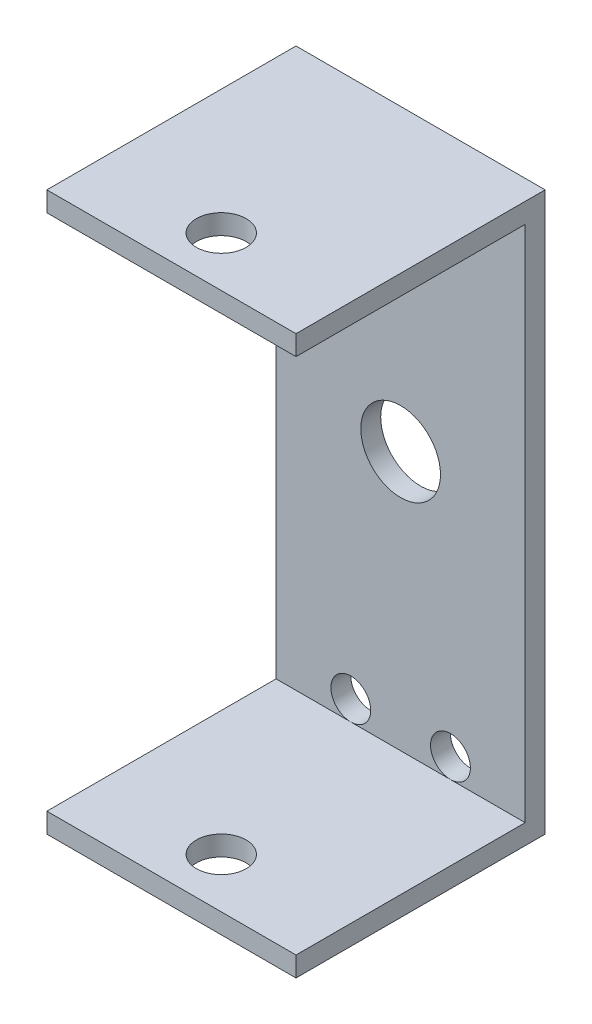
ISO-10303-21;
HEADER;
FILE_DESCRIPTION(('STEP AP214'),'2;1');
FILE_NAME('part.step','',(''),(''),'','','');
FILE_SCHEMA(('AUTOMOTIVE_DESIGN { 1 0 10303 214 1 1 1 1 }'));
ENDSEC;
DATA;
#1=APPLICATION_CONTEXT('core data for automotive mechanical design processes');
#2=APPLICATION_PROTOCOL_DEFINITION('international standard','automotive_design',2000,#1);
#3=PRODUCT_CONTEXT('',#1,'mechanical');
#4=PRODUCT('Part','Part','',(#3));
#5=PRODUCT_RELATED_PRODUCT_CATEGORY('part','',(#4));
#6=PRODUCT_DEFINITION_FORMATION('','',#4);
#7=PRODUCT_DEFINITION_CONTEXT('part definition',#1,'design');
#8=PRODUCT_DEFINITION('design','',#6,#7);
#9=PRODUCT_DEFINITION_SHAPE('','',#8);
#10=(LENGTH_UNIT() NAMED_UNIT(*) SI_UNIT(.MILLI.,.METRE.));
#11=(NAMED_UNIT(*) PLANE_ANGLE_UNIT() SI_UNIT($,.RADIAN.));
#12=(NAMED_UNIT(*) SI_UNIT($,.STERADIAN.) SOLID_ANGLE_UNIT());
#13=UNCERTAINTY_MEASURE_WITH_UNIT(LENGTH_MEASURE(1.E-05),#10,'distance_accuracy_value','');
#14=(GEOMETRIC_REPRESENTATION_CONTEXT(3) GLOBAL_UNCERTAINTY_ASSIGNED_CONTEXT((#13)) GLOBAL_UNIT_ASSIGNED_CONTEXT((#10,
#11,#12)) REPRESENTATION_CONTEXT('',''));
#15=CARTESIAN_POINT('',(0.,0.,0.));
#16=DIRECTION('',(0.,0.,1.));
#17=DIRECTION('',(1.,0.,0.));
#18=AXIS2_PLACEMENT_3D('',#15,#16,#17);
#19=CARTESIAN_POINT('',(-12.6747704507397,30.5029426241211,2.));
#20=DIRECTION('',(1.,0.,0.));
#21=DIRECTION('',(0.,1.,0.));
#22=AXIS2_PLACEMENT_3D('',#19,#20,#21);
#23=PLANE('',#22);
#24=DIRECTION('',(0.,-1.,0.));
#25=VECTOR('',#24,1.);
#26=CARTESIAN_POINT('',(-12.6747704507397,30.5029426241211,0.));
#27=LINE('',#26,#25);
#28=CARTESIAN_POINT('',(-12.6747704507397,32.5029426241211,0.));
#29=VERTEX_POINT('',#28);
#30=CARTESIAN_POINT('',(-12.6747704507397,-23.4970573758789,0.));
#31=VERTEX_POINT('',#30);
#32=EDGE_CURVE('E172',#29,#31,#27,.T.);
#33=ORIENTED_EDGE('',*,*,#32,.T.);
#34=DIRECTION('',(0.,0.,-1.));
#35=VECTOR('',#34,1.);
#36=CARTESIAN_POINT('',(-12.6747704507397,-23.4970573758789,0.));
#37=LINE('',#36,#35);
#38=CARTESIAN_POINT('',(-12.6747704507397,-23.4970573758789,25.));
#39=VERTEX_POINT('',#38);
#40=EDGE_CURVE('E119',#39,#31,#37,.T.);
#41=ORIENTED_EDGE('',*,*,#40,.F.);
#42=DIRECTION('',(0.,1.,0.));
#43=VECTOR('',#42,1.);
#44=CARTESIAN_POINT('',(-12.6747704507397,-23.4970573758789,25.));
#45=LINE('',#44,#43);
#46=CARTESIAN_POINT('',(-12.6747704507397,-21.4970573758789,25.));
#47=VERTEX_POINT('',#46);
#48=EDGE_CURVE('E115',#39,#47,#45,.T.);
#49=ORIENTED_EDGE('',*,*,#48,.T.);
#50=DIRECTION('',(0.,0.,-1.));
#51=VECTOR('',#50,1.);
#52=CARTESIAN_POINT('',(-12.6747704507397,-21.4970573758789,0.));
#53=LINE('',#52,#51);
#54=CARTESIAN_POINT('',(-12.6747704507397,-21.4970573758789,2.));
#55=VERTEX_POINT('',#54);
#56=EDGE_CURVE('E128',#47,#55,#53,.T.);
#57=ORIENTED_EDGE('',*,*,#56,.T.);
#58=DIRECTION('',(0.,-1.,0.));
#59=VECTOR('',#58,1.);
#60=CARTESIAN_POINT('',(-12.6747704507397,30.5029426241211,2.));
#61=LINE('',#60,#59);
#62=CARTESIAN_POINT('',(-12.6747704507397,30.5029426241211,2.));
#63=VERTEX_POINT('',#62);
#64=EDGE_CURVE('E157',#63,#55,#61,.T.);
#65=ORIENTED_EDGE('',*,*,#64,.F.);
#66=DIRECTION('',(0.,0.,1.));
#67=VECTOR('',#66,1.);
#68=CARTESIAN_POINT('',(-12.6747704507397,30.5029426241211,0.));
#69=LINE('',#68,#67);
#70=CARTESIAN_POINT('',(-12.6747704507397,30.5029426241211,25.));
#71=VERTEX_POINT('',#70);
#72=EDGE_CURVE('E135',#63,#71,#69,.T.);
#73=ORIENTED_EDGE('',*,*,#72,.T.);
#74=DIRECTION('',(0.,-1.,0.));
#75=VECTOR('',#74,1.);
#76=CARTESIAN_POINT('',(-12.6747704507397,32.5029426241211,25.));
#77=LINE('',#76,#75);
#78=CARTESIAN_POINT('',(-12.6747704507397,32.5029426241211,25.));
#79=VERTEX_POINT('',#78);
#80=EDGE_CURVE('E220',#79,#71,#77,.T.);
#81=ORIENTED_EDGE('',*,*,#80,.F.);
#82=DIRECTION('',(0.,0.,1.));
#83=VECTOR('',#82,1.);
#84=CARTESIAN_POINT('',(-12.6747704507397,32.5029426241211,0.));
#85=LINE('',#84,#83);
#86=EDGE_CURVE('E208',#29,#79,#85,.T.);
#87=ORIENTED_EDGE('',*,*,#86,.F.);
#88=EDGE_LOOP('',(#33,#41,#49,#57,#65,#73,#81,#87));
#89=FACE_BOUND('',#88,.T.);
#90=ADVANCED_FACE('F32',(#89),#23,.F.);
#91=CARTESIAN_POINT('',(12.3252295492603,30.5029426241211,2.));
#92=DIRECTION('',(-1.,0.,0.));
#93=DIRECTION('',(0.,-1.,0.));
#94=AXIS2_PLACEMENT_3D('',#91,#92,#93);
#95=PLANE('',#94);
#96=DIRECTION('',(0.,1.,0.));
#97=VECTOR('',#96,1.);
#98=CARTESIAN_POINT('',(12.3252295492603,30.5029426241211,0.));
#99=LINE('',#98,#97);
#100=CARTESIAN_POINT('',(12.3252295492603,-23.4970573758789,0.));
#101=VERTEX_POINT('',#100);
#102=CARTESIAN_POINT('',(12.3252295492603,32.5029426241211,0.));
#103=VERTEX_POINT('',#102);
#104=EDGE_CURVE('E168',#101,#103,#99,.T.);
#105=ORIENTED_EDGE('',*,*,#104,.T.);
#106=DIRECTION('',(0.,0.,-1.));
#107=VECTOR('',#106,1.);
#108=CARTESIAN_POINT('',(12.3252295492603,32.5029426241211,0.));
#109=LINE('',#108,#107);
#110=CARTESIAN_POINT('',(12.3252295492603,32.5029426241211,25.));
#111=VERTEX_POINT('',#110);
#112=EDGE_CURVE('E229',#111,#103,#109,.T.);
#113=ORIENTED_EDGE('',*,*,#112,.F.);
#114=DIRECTION('',(0.,-1.,0.));
#115=VECTOR('',#114,1.);
#116=CARTESIAN_POINT('',(12.3252295492603,32.5029426241211,25.));
#117=LINE('',#116,#115);
#118=CARTESIAN_POINT('',(12.3252295492603,30.5029426241211,25.));
#119=VERTEX_POINT('',#118);
#120=EDGE_CURVE('E206',#111,#119,#117,.T.);
#121=ORIENTED_EDGE('',*,*,#120,.T.);
#122=DIRECTION('',(0.,0.,-1.));
#123=VECTOR('',#122,1.);
#124=CARTESIAN_POINT('',(12.3252295492603,30.5029426241211,0.));
#125=LINE('',#124,#123);
#126=CARTESIAN_POINT('',(12.3252295492603,30.5029426241211,2.));
#127=VERTEX_POINT('',#126);
#128=EDGE_CURVE('E188',#119,#127,#125,.T.);
#129=ORIENTED_EDGE('',*,*,#128,.T.);
#130=DIRECTION('',(0.,1.,0.));
#131=VECTOR('',#130,1.);
#132=CARTESIAN_POINT('',(12.3252295492603,30.5029426241211,2.));
#133=LINE('',#132,#131);
#134=CARTESIAN_POINT('',(12.3252295492603,-21.4970573758789,2.));
#135=VERTEX_POINT('',#134);
#136=EDGE_CURVE('E177',#135,#127,#133,.T.);
#137=ORIENTED_EDGE('',*,*,#136,.F.);
#138=DIRECTION('',(0.,0.,1.));
#139=VECTOR('',#138,1.);
#140=CARTESIAN_POINT('',(12.3252295492603,-21.4970573758789,0.));
#141=LINE('',#140,#139);
#142=CARTESIAN_POINT('',(12.3252295492603,-21.4970573758789,25.));
#143=VERTEX_POINT('',#142);
#144=EDGE_CURVE('E133',#135,#143,#141,.T.);
#145=ORIENTED_EDGE('',*,*,#144,.T.);
#146=DIRECTION('',(0.,1.,0.));
#147=VECTOR('',#146,1.);
#148=CARTESIAN_POINT('',(12.3252295492603,-23.4970573758789,25.));
#149=LINE('',#148,#147);
#150=CARTESIAN_POINT('',(12.3252295492603,-23.4970573758789,25.));
#151=VERTEX_POINT('',#150);
#152=EDGE_CURVE('E113',#151,#143,#149,.T.);
#153=ORIENTED_EDGE('',*,*,#152,.F.);
#154=DIRECTION('',(0.,0.,1.));
#155=VECTOR('',#154,1.);
#156=CARTESIAN_POINT('',(12.3252295492603,-23.4970573758789,0.));
#157=LINE('',#156,#155);
#158=EDGE_CURVE('E120',#101,#151,#157,.T.);
#159=ORIENTED_EDGE('',*,*,#158,.F.);
#160=EDGE_LOOP('',(#105,#113,#121,#129,#137,#145,#153,#159));
#161=FACE_BOUND('',#160,.T.);
#162=ADVANCED_FACE('F130',(#161),#95,.F.);
#163=CARTESIAN_POINT('',(0.,0.,2.));
#164=DIRECTION('',(0.,0.,1.));
#165=DIRECTION('',(1.,0.,0.));
#166=AXIS2_PLACEMENT_3D('',#163,#164,#165);
#167=PLANE('',#166);
#168=CARTESIAN_POINT('',(-0.174770450739726,4.5029426241211,2.));
#169=DIRECTION('',(0.,0.,1.));
#170=DIRECTION('',(1.,0.,0.));
#171=AXIS2_PLACEMENT_3D('',#168,#169,#170);
#172=CIRCLE('',#171,4.);
#173=CARTESIAN_POINT('',(3.82522954926027,4.5029426241211,2.));
#174=VERTEX_POINT('',#173);
#175=EDGE_CURVE('E145',#174,#174,#172,.T.);
#176=ORIENTED_EDGE('',*,*,#175,.F.);
#177=EDGE_LOOP('',(#176));
#178=FACE_BOUND('',#177,.T.);
#179=DIRECTION('',(-1.,0.,0.));
#180=VECTOR('',#179,1.);
#181=CARTESIAN_POINT('',(-12.6747704507397,30.5029426241211,2.));
#182=LINE('',#181,#180);
#183=CARTESIAN_POINT('',(4.82522954926028,30.5029426241211,2.));
#184=VERTEX_POINT('',#183);
#185=CARTESIAN_POINT('',(-5.17477045073973,30.5029426241211,2.));
#186=VERTEX_POINT('',#185);
#187=EDGE_CURVE('E41',#184,#186,#182,.T.);
#188=ORIENTED_EDGE('',*,*,#187,.T.);
#189=CARTESIAN_POINT('',(-5.17477045073973,28.5029426241211,2.));
#190=DIRECTION('',(0.,0.,1.));
#191=DIRECTION('',(1.,0.,0.));
#192=AXIS2_PLACEMENT_3D('',#189,#190,#191);
#193=CIRCLE('',#192,2.);
#194=EDGE_CURVE('E47',#186,#186,#193,.T.);
#195=ORIENTED_EDGE('',*,*,#194,.F.);
#196=EDGE_CURVE('E35',#186,#63,#182,.T.);
#197=ORIENTED_EDGE('',*,*,#196,.T.);
#198=ORIENTED_EDGE('',*,*,#64,.T.);
#199=DIRECTION('',(1.,0.,0.));
#200=VECTOR('',#199,1.);
#201=CARTESIAN_POINT('',(-12.6747704507397,-21.4970573758789,2.));
#202=LINE('',#201,#200);
#203=CARTESIAN_POINT('',(-5.17477045073972,-21.4970573758789,2.));
#204=VERTEX_POINT('',#203);
#205=EDGE_CURVE('E164',#55,#204,#202,.T.);
#206=ORIENTED_EDGE('',*,*,#205,.T.);
#207=CARTESIAN_POINT('',(-5.17477045073972,-19.4970573758789,2.));
#208=DIRECTION('',(0.,0.,1.));
#209=DIRECTION('',(1.,0.,0.));
#210=AXIS2_PLACEMENT_3D('',#207,#208,#209);
#211=CIRCLE('',#210,2.);
#212=EDGE_CURVE('E274',#204,#204,#211,.T.);
#213=ORIENTED_EDGE('',*,*,#212,.F.);
#214=CARTESIAN_POINT('',(4.82522954926028,-21.4970573758789,2.));
#215=VERTEX_POINT('',#214);
#216=EDGE_CURVE('E170',#204,#215,#202,.T.);
#217=ORIENTED_EDGE('',*,*,#216,.T.);
#218=CARTESIAN_POINT('',(4.82522954926028,-19.4970573758789,2.));
#219=DIRECTION('',(0.,0.,1.));
#220=DIRECTION('',(1.,0.,0.));
#221=AXIS2_PLACEMENT_3D('',#218,#219,#220);
#222=CIRCLE('',#221,2.);
#223=EDGE_CURVE('E279',#215,#215,#222,.T.);
#224=ORIENTED_EDGE('',*,*,#223,.F.);
#225=EDGE_CURVE('E167',#215,#135,#202,.T.);
#226=ORIENTED_EDGE('',*,*,#225,.T.);
#227=ORIENTED_EDGE('',*,*,#136,.T.);
#228=EDGE_CURVE('E11',#127,#184,#182,.T.);
#229=ORIENTED_EDGE('',*,*,#228,.T.);
#230=CARTESIAN_POINT('',(4.82522954926028,28.5029426241211,2.));
#231=DIRECTION('',(0.,0.,1.));
#232=DIRECTION('',(1.,0.,0.));
#233=AXIS2_PLACEMENT_3D('',#230,#231,#232);
#234=CIRCLE('',#233,2.);
#235=EDGE_CURVE('E52',#184,#184,#234,.T.);
#236=ORIENTED_EDGE('',*,*,#235,.F.);
#237=EDGE_LOOP('',(#188,#195,#197,#198,#206,#213,#217,#224,#226,#227,#229,#236));
#238=FACE_BOUND('',#237,.T.);
#239=ADVANCED_FACE('F162',(#178,#238),#167,.T.);
#240=CARTESIAN_POINT('',(0.,0.,0.));
#241=DIRECTION('',(0.,0.,1.));
#242=DIRECTION('',(1.,0.,0.));
#243=AXIS2_PLACEMENT_3D('',#240,#241,#242);
#244=PLANE('',#243);
#245=CARTESIAN_POINT('',(-5.17477045073973,28.5029426241211,0.));
#246=DIRECTION('',(0.,0.,-1.));
#247=DIRECTION('',(-1.,0.,0.));
#248=AXIS2_PLACEMENT_3D('',#245,#246,#247);
#249=CIRCLE('',#248,2.);
#250=CARTESIAN_POINT('',(-7.17477045073973,28.5029426241211,0.));
#251=VERTEX_POINT('',#250);
#252=EDGE_CURVE('E289',#251,#251,#249,.T.);
#253=ORIENTED_EDGE('',*,*,#252,.F.);
#254=EDGE_LOOP('',(#253));
#255=FACE_BOUND('',#254,.T.);
#256=CARTESIAN_POINT('',(4.82522954926028,28.5029426241211,0.));
#257=DIRECTION('',(0.,0.,-1.));
#258=DIRECTION('',(-1.,0.,0.));
#259=AXIS2_PLACEMENT_3D('',#256,#257,#258);
#260=CIRCLE('',#259,2.);
#261=CARTESIAN_POINT('',(2.82522954926028,28.5029426241211,0.));
#262=VERTEX_POINT('',#261);
#263=EDGE_CURVE('E285',#262,#262,#260,.T.);
#264=ORIENTED_EDGE('',*,*,#263,.F.);
#265=EDGE_LOOP('',(#264));
#266=FACE_BOUND('',#265,.T.);
#267=CARTESIAN_POINT('',(4.82522954926028,-19.4970573758789,0.));
#268=DIRECTION('',(0.,0.,-1.));
#269=DIRECTION('',(-1.,0.,0.));
#270=AXIS2_PLACEMENT_3D('',#267,#268,#269);
#271=CIRCLE('',#270,2.);
#272=CARTESIAN_POINT('',(2.82522954926028,-19.4970573758789,0.));
#273=VERTEX_POINT('',#272);
#274=EDGE_CURVE('E281',#273,#273,#271,.T.);
#275=ORIENTED_EDGE('',*,*,#274,.F.);
#276=EDGE_LOOP('',(#275));
#277=FACE_BOUND('',#276,.T.);
#278=CARTESIAN_POINT('',(-5.17477045073972,-19.4970573758789,0.));
#279=DIRECTION('',(0.,0.,-1.));
#280=DIRECTION('',(-1.,0.,0.));
#281=AXIS2_PLACEMENT_3D('',#278,#279,#280);
#282=CIRCLE('',#281,2.);
#283=CARTESIAN_POINT('',(-7.17477045073972,-19.4970573758789,0.));
#284=VERTEX_POINT('',#283);
#285=EDGE_CURVE('E276',#284,#284,#282,.T.);
#286=ORIENTED_EDGE('',*,*,#285,.F.);
#287=EDGE_LOOP('',(#286));
#288=FACE_BOUND('',#287,.T.);
#289=CARTESIAN_POINT('',(-0.174770450739726,4.5029426241211,0.));
#290=DIRECTION('',(0.,0.,-1.));
#291=DIRECTION('',(-1.,0.,0.));
#292=AXIS2_PLACEMENT_3D('',#289,#290,#291);
#293=CIRCLE('',#292,4.);
#294=CARTESIAN_POINT('',(-4.17477045073973,4.5029426241211,0.));
#295=VERTEX_POINT('',#294);
#296=EDGE_CURVE('E260',#295,#295,#293,.T.);
#297=ORIENTED_EDGE('',*,*,#296,.F.);
#298=EDGE_LOOP('',(#297));
#299=FACE_BOUND('',#298,.T.);
#300=ORIENTED_EDGE('',*,*,#32,.F.);
#301=DIRECTION('',(-1.,0.,0.));
#302=VECTOR('',#301,1.);
#303=CARTESIAN_POINT('',(-12.6747704507397,32.5029426241211,0.));
#304=LINE('',#303,#302);
#305=EDGE_CURVE('E221',#103,#29,#304,.T.);
#306=ORIENTED_EDGE('',*,*,#305,.F.);
#307=ORIENTED_EDGE('',*,*,#104,.F.);
#308=DIRECTION('',(1.,0.,0.));
#309=VECTOR('',#308,1.);
#310=CARTESIAN_POINT('',(12.3252295492603,-23.4970573758789,0.));
#311=LINE('',#310,#309);
#312=EDGE_CURVE('E126',#31,#101,#311,.T.);
#313=ORIENTED_EDGE('',*,*,#312,.F.);
#314=EDGE_LOOP('',(#300,#306,#307,#313));
#315=FACE_BOUND('',#314,.T.);
#316=ADVANCED_FACE('F227',(#255,#266,#277,#288,#299,#315),#244,.F.);
#317=CARTESIAN_POINT('',(-12.6747704507397,32.5029426241211,25.));
#318=DIRECTION('',(0.,0.,-1.));
#319=DIRECTION('',(-1.,0.,0.));
#320=AXIS2_PLACEMENT_3D('',#317,#318,#319);
#321=PLANE('',#320);
#322=DIRECTION('',(1.,0.,0.));
#323=VECTOR('',#322,1.);
#324=CARTESIAN_POINT('',(-12.6747704507397,30.5029426241211,25.));
#325=LINE('',#324,#323);
#326=EDGE_CURVE('E137',#71,#119,#325,.T.);
#327=ORIENTED_EDGE('',*,*,#326,.T.);
#328=ORIENTED_EDGE('',*,*,#120,.F.);
#329=DIRECTION('',(1.,0.,0.));
#330=VECTOR('',#329,1.);
#331=CARTESIAN_POINT('',(-12.6747704507397,32.5029426241211,25.));
#332=LINE('',#331,#330);
#333=EDGE_CURVE('E210',#79,#111,#332,.T.);
#334=ORIENTED_EDGE('',*,*,#333,.F.);
#335=ORIENTED_EDGE('',*,*,#80,.T.);
#336=EDGE_LOOP('',(#327,#328,#334,#335));
#337=FACE_BOUND('',#336,.T.);
#338=ADVANCED_FACE('F234',(#337),#321,.F.);
#339=CARTESIAN_POINT('',(0.,32.5029426241211,0.));
#340=DIRECTION('',(0.,1.,0.));
#341=DIRECTION('',(0.,0.,1.));
#342=AXIS2_PLACEMENT_3D('',#339,#340,#341);
#343=PLANE('',#342);
#344=CARTESIAN_POINT('',(-0.174770450739719,32.5029426241211,20.));
#345=DIRECTION('',(0.,1.,0.));
#346=DIRECTION('',(0.,0.,1.));
#347=AXIS2_PLACEMENT_3D('',#344,#345,#346);
#348=CIRCLE('',#347,2.5);
#349=CARTESIAN_POINT('',(-0.174770450739719,32.5029426241211,17.5));
#350=VERTEX_POINT('',#349);
#351=EDGE_CURVE('E263',#350,#350,#348,.T.);
#352=ORIENTED_EDGE('',*,*,#351,.F.);
#353=EDGE_LOOP('',(#352));
#354=FACE_BOUND('',#353,.T.);
#355=ORIENTED_EDGE('',*,*,#86,.T.);
#356=ORIENTED_EDGE('',*,*,#333,.T.);
#357=ORIENTED_EDGE('',*,*,#112,.T.);
#358=ORIENTED_EDGE('',*,*,#305,.T.);
#359=EDGE_LOOP('',(#355,#356,#357,#358));
#360=FACE_BOUND('',#359,.T.);
#361=ADVANCED_FACE('F231',(#354,#360),#343,.T.);
#362=CARTESIAN_POINT('',(0.,30.5029426241211,0.));
#363=DIRECTION('',(0.,1.,0.));
#364=DIRECTION('',(0.,0.,1.));
#365=AXIS2_PLACEMENT_3D('',#362,#363,#364);
#366=PLANE('',#365);
#367=ORIENTED_EDGE('',*,*,#196,.F.);
#368=ORIENTED_EDGE('',*,*,#187,.F.);
#369=ORIENTED_EDGE('',*,*,#228,.F.);
#370=ORIENTED_EDGE('',*,*,#128,.F.);
#371=ORIENTED_EDGE('',*,*,#326,.F.);
#372=ORIENTED_EDGE('',*,*,#72,.F.);
#373=EDGE_LOOP('',(#367,#368,#369,#370,#371,#372));
#374=FACE_BOUND('',#373,.T.);
#375=CARTESIAN_POINT('',(-0.174770450739719,30.5029426241211,20.));
#376=DIRECTION('',(0.,1.,0.));
#377=DIRECTION('',(0.,0.,1.));
#378=AXIS2_PLACEMENT_3D('',#375,#376,#377);
#379=CIRCLE('',#378,2.5);
#380=CARTESIAN_POINT('',(-0.174770450739719,30.5029426241211,17.5));
#381=VERTEX_POINT('',#380);
#382=EDGE_CURVE('E268',#381,#381,#379,.T.);
#383=ORIENTED_EDGE('',*,*,#382,.T.);
#384=EDGE_LOOP('',(#383));
#385=FACE_BOUND('',#384,.T.);
#386=ADVANCED_FACE('F197',(#374,#385),#366,.F.);
#387=CARTESIAN_POINT('',(12.3252295492603,-23.4970573758789,25.));
#388=DIRECTION('',(0.,0.,-1.));
#389=DIRECTION('',(-1.,0.,0.));
#390=AXIS2_PLACEMENT_3D('',#387,#388,#389);
#391=PLANE('',#390);
#392=DIRECTION('',(-1.,0.,0.));
#393=VECTOR('',#392,1.);
#394=CARTESIAN_POINT('',(12.3252295492603,-21.4970573758789,25.));
#395=LINE('',#394,#393);
#396=EDGE_CURVE('E144',#143,#47,#395,.T.);
#397=ORIENTED_EDGE('',*,*,#396,.T.);
#398=ORIENTED_EDGE('',*,*,#48,.F.);
#399=DIRECTION('',(-1.,0.,0.));
#400=VECTOR('',#399,1.);
#401=CARTESIAN_POINT('',(12.3252295492603,-23.4970573758789,25.));
#402=LINE('',#401,#400);
#403=EDGE_CURVE('E109',#151,#39,#402,.T.);
#404=ORIENTED_EDGE('',*,*,#403,.F.);
#405=ORIENTED_EDGE('',*,*,#152,.T.);
#406=EDGE_LOOP('',(#397,#398,#404,#405));
#407=FACE_BOUND('',#406,.T.);
#408=ADVANCED_FACE('F111',(#407),#391,.F.);
#409=CARTESIAN_POINT('',(0.,-23.4970573758789,0.));
#410=DIRECTION('',(0.,-1.,0.));
#411=DIRECTION('',(0.,0.,-1.));
#412=AXIS2_PLACEMENT_3D('',#409,#410,#411);
#413=PLANE('',#412);
#414=CARTESIAN_POINT('',(-0.174770450739719,-23.4970573758789,20.));
#415=DIRECTION('',(0.,-1.,0.));
#416=DIRECTION('',(0.,0.,-1.));
#417=AXIS2_PLACEMENT_3D('',#414,#415,#416);
#418=CIRCLE('',#417,2.5);
#419=CARTESIAN_POINT('',(-0.174770450739719,-23.4970573758789,17.5));
#420=VERTEX_POINT('',#419);
#421=EDGE_CURVE('E271',#420,#420,#418,.T.);
#422=ORIENTED_EDGE('',*,*,#421,.F.);
#423=EDGE_LOOP('',(#422));
#424=FACE_BOUND('',#423,.T.);
#425=ORIENTED_EDGE('',*,*,#158,.T.);
#426=ORIENTED_EDGE('',*,*,#403,.T.);
#427=ORIENTED_EDGE('',*,*,#40,.T.);
#428=ORIENTED_EDGE('',*,*,#312,.T.);
#429=EDGE_LOOP('',(#425,#426,#427,#428));
#430=FACE_BOUND('',#429,.T.);
#431=ADVANCED_FACE('F124',(#424,#430),#413,.T.);
#432=CARTESIAN_POINT('',(0.,-21.4970573758789,0.));
#433=DIRECTION('',(0.,-1.,0.));
#434=DIRECTION('',(0.,0.,-1.));
#435=AXIS2_PLACEMENT_3D('',#432,#433,#434);
#436=PLANE('',#435);
#437=ORIENTED_EDGE('',*,*,#225,.F.);
#438=ORIENTED_EDGE('',*,*,#216,.F.);
#439=ORIENTED_EDGE('',*,*,#205,.F.);
#440=ORIENTED_EDGE('',*,*,#56,.F.);
#441=ORIENTED_EDGE('',*,*,#396,.F.);
#442=ORIENTED_EDGE('',*,*,#144,.F.);
#443=EDGE_LOOP('',(#437,#438,#439,#440,#441,#442));
#444=FACE_BOUND('',#443,.T.);
#445=CARTESIAN_POINT('',(-0.174770450739719,-21.4970573758789,20.));
#446=DIRECTION('',(0.,-1.,0.));
#447=DIRECTION('',(0.,0.,-1.));
#448=AXIS2_PLACEMENT_3D('',#445,#446,#447);
#449=CIRCLE('',#448,2.5);
#450=CARTESIAN_POINT('',(-0.174770450739719,-21.4970573758789,17.5));
#451=VERTEX_POINT('',#450);
#452=EDGE_CURVE('E184',#451,#451,#449,.T.);
#453=ORIENTED_EDGE('',*,*,#452,.T.);
#454=EDGE_LOOP('',(#453));
#455=FACE_BOUND('',#454,.T.);
#456=ADVANCED_FACE('F306',(#444,#455),#436,.F.);
#457=CARTESIAN_POINT('',(-0.174770450739726,4.5029426241211,21.));
#458=DIRECTION('',(0.,0.,-1.));
#459=DIRECTION('',(-1.,0.,0.));
#460=AXIS2_PLACEMENT_3D('',#457,#458,#459);
#461=CYLINDRICAL_SURFACE('',#460,4.);
#462=ORIENTED_EDGE('',*,*,#175,.T.);
#463=EDGE_LOOP('',(#462));
#464=FACE_BOUND('',#463,.T.);
#465=ORIENTED_EDGE('',*,*,#296,.T.);
#466=EDGE_LOOP('',(#465));
#467=FACE_BOUND('',#466,.T.);
#468=ADVANCED_FACE('F303',(#464,#467),#461,.F.);
#469=CARTESIAN_POINT('',(-0.174770450739719,60.5029426241211,20.));
#470=DIRECTION('',(0.,-1.,0.));
#471=DIRECTION('',(0.,0.,-1.));
#472=AXIS2_PLACEMENT_3D('',#469,#470,#471);
#473=CYLINDRICAL_SURFACE('',#472,2.5);
#474=CARTESIAN_POINT('',(-0.174770450739719,-23.4970573758789,17.5));
#475=CARTESIAN_POINT('',(-0.174770450739719,-23.4762240425456,17.5));
#476=CARTESIAN_POINT('',(-0.174770450739719,-23.4553907092122,17.5));
#477=CARTESIAN_POINT('',(-0.174770450739719,-23.4137240425456,17.5));
#478=CARTESIAN_POINT('',(-0.174770450739719,-23.3928907092122,17.5));
#479=CARTESIAN_POINT('',(-0.174770450739719,-23.3512240425456,17.5));
#480=CARTESIAN_POINT('',(-0.174770450739719,-23.3303907092122,17.5));
#481=CARTESIAN_POINT('',(-0.174770450739719,-23.2887240425456,17.5));
#482=CARTESIAN_POINT('',(-0.174770450739719,-23.2678907092122,17.5));
#483=CARTESIAN_POINT('',(-0.174770450739719,-23.2262240425456,17.5));
#484=CARTESIAN_POINT('',(-0.174770450739719,-23.2053907092122,17.5));
#485=CARTESIAN_POINT('',(-0.174770450739719,-23.1637240425456,17.5));
#486=CARTESIAN_POINT('',(-0.174770450739719,-23.1428907092122,17.5));
#487=CARTESIAN_POINT('',(-0.174770450739719,-23.1012240425456,17.5));
#488=CARTESIAN_POINT('',(-0.174770450739719,-23.0803907092122,17.5));
#489=CARTESIAN_POINT('',(-0.174770450739719,-23.0387240425456,17.5));
#490=CARTESIAN_POINT('',(-0.174770450739719,-23.0178907092122,17.5));
#491=CARTESIAN_POINT('',(-0.174770450739719,-22.9762240425456,17.5));
#492=CARTESIAN_POINT('',(-0.174770450739719,-22.9553907092122,17.5));
#493=CARTESIAN_POINT('',(-0.174770450739719,-22.9137240425456,17.5));
#494=CARTESIAN_POINT('',(-0.174770450739719,-22.8928907092122,17.5));
#495=CARTESIAN_POINT('',(-0.174770450739719,-22.8512240425456,17.5));
#496=CARTESIAN_POINT('',(-0.174770450739719,-22.8303907092122,17.5));
#497=CARTESIAN_POINT('',(-0.174770450739719,-22.7887240425456,17.5));
#498=CARTESIAN_POINT('',(-0.174770450739719,-22.7678907092122,17.5));
#499=CARTESIAN_POINT('',(-0.174770450739719,-22.7262240425456,17.5));
#500=CARTESIAN_POINT('',(-0.174770450739719,-22.7053907092122,17.5));
#501=CARTESIAN_POINT('',(-0.174770450739719,-22.6637240425456,17.5));
#502=CARTESIAN_POINT('',(-0.174770450739719,-22.6428907092122,17.5));
#503=CARTESIAN_POINT('',(-0.174770450739719,-22.6012240425456,17.5));
#504=CARTESIAN_POINT('',(-0.174770450739719,-22.5803907092122,17.5));
#505=CARTESIAN_POINT('',(-0.174770450739719,-22.5387240425456,17.5));
#506=CARTESIAN_POINT('',(-0.174770450739719,-22.5178907092122,17.5));
#507=CARTESIAN_POINT('',(-0.174770450739719,-22.4762240425456,17.5));
#508=CARTESIAN_POINT('',(-0.174770450739719,-22.4553907092122,17.5));
#509=CARTESIAN_POINT('',(-0.174770450739719,-22.4137240425456,17.5));
#510=CARTESIAN_POINT('',(-0.174770450739719,-22.3928907092122,17.5));
#511=CARTESIAN_POINT('',(-0.174770450739719,-22.3512240425456,17.5));
#512=CARTESIAN_POINT('',(-0.174770450739719,-22.3303907092122,17.5));
#513=CARTESIAN_POINT('',(-0.174770450739719,-22.2887240425456,17.5));
#514=CARTESIAN_POINT('',(-0.174770450739719,-22.2678907092122,17.5));
#515=CARTESIAN_POINT('',(-0.174770450739719,-22.2262240425456,17.5));
#516=CARTESIAN_POINT('',(-0.174770450739719,-22.2053907092122,17.5));
#517=CARTESIAN_POINT('',(-0.174770450739719,-22.1637240425456,17.5));
#518=CARTESIAN_POINT('',(-0.174770450739719,-22.1428907092122,17.5));
#519=CARTESIAN_POINT('',(-0.174770450739719,-22.1012240425456,17.5));
#520=CARTESIAN_POINT('',(-0.174770450739719,-22.0803907092122,17.5));
#521=CARTESIAN_POINT('',(-0.174770450739719,-22.0387240425456,17.5));
#522=CARTESIAN_POINT('',(-0.174770450739719,-22.0178907092122,17.5));
#523=CARTESIAN_POINT('',(-0.174770450739719,-21.9762240425456,17.5));
#524=CARTESIAN_POINT('',(-0.174770450739719,-21.9553907092122,17.5));
#525=CARTESIAN_POINT('',(-0.174770450739719,-21.9137240425456,17.5));
#526=CARTESIAN_POINT('',(-0.174770450739719,-21.8928907092122,17.5));
#527=CARTESIAN_POINT('',(-0.174770450739719,-21.8512240425456,17.5));
#528=CARTESIAN_POINT('',(-0.174770450739719,-21.8303907092122,17.5));
#529=CARTESIAN_POINT('',(-0.174770450739719,-21.7887240425456,17.5));
#530=CARTESIAN_POINT('',(-0.174770450739719,-21.7678907092122,17.5));
#531=CARTESIAN_POINT('',(-0.174770450739719,-21.7262240425456,17.5));
#532=CARTESIAN_POINT('',(-0.174770450739719,-21.7053907092122,17.5));
#533=CARTESIAN_POINT('',(-0.174770450739719,-21.6637240425456,17.5));
#534=CARTESIAN_POINT('',(-0.174770450739719,-21.6428907092122,17.5));
#535=CARTESIAN_POINT('',(-0.174770450739719,-21.6012240425456,17.5));
#536=CARTESIAN_POINT('',(-0.174770450739719,-21.5803907092122,17.5));
#537=CARTESIAN_POINT('',(-0.174770450739719,-21.5387240425456,17.5));
#538=CARTESIAN_POINT('',(-0.174770450739719,-21.5178907092122,17.5));
#539=CARTESIAN_POINT('',(-0.174770450739719,-21.4970573758789,17.5));
#540=B_SPLINE_CURVE_WITH_KNOTS('',3,(#474,#475,#476,#477,#478,#479,#480,#481,#482,#483,#484,
#485,#486,#487,#488,#489,#490,#491,#492,#493,#494,#495,#496,#497,#498,#499,#500,#501,#502,#503,
#504,#505,#506,#507,#508,#509,#510,#511,#512,#513,#514,#515,#516,#517,#518,#519,#520,#521,#522,
#523,#524,#525,#526,#527,#528,#529,#530,#531,#532,#533,#534,#535,#536,#537,#538,#539),
.UNSPECIFIED.,.F.,.F.,(4,2,2,2,2,2,2,2,2,2,2,2,2,2,2,2,2,2,2,2,2,2,2,2,2,2,2,2,2,2,2,2,4),(0.,
0.0624999999999931,0.125,0.187500000000007,0.25,0.312499999999993,0.375,0.437500000000007,0.5,
0.562499999999994,0.625000000000001,0.687500000000008,0.750000000000001,0.812499999999994,
0.875000000000001,0.937500000000008,1.,1.06249999999999,1.125,1.18750000000001,1.25,
1.31249999999999,1.375,1.43750000000001,1.5,1.56249999999999,1.625,1.68750000000001,1.75,
1.81249999999999,1.875,1.93750000000001,2.),.UNSPECIFIED.);
#541=EDGE_CURVE('BSEAM305',#420,#451,#540,.T.);
#542=ORIENTED_EDGE('',*,*,#421,.T.);
#543=ORIENTED_EDGE('',*,*,#452,.F.);
#544=ORIENTED_EDGE('',*,*,#541,.T.);
#545=ORIENTED_EDGE('',*,*,#541,.F.);
#546=EDGE_LOOP('',(#542,#544,#543,#545));
#547=FACE_BOUND('',#546,.T.);
#548=ADVANCED_FACE('F305',(#547),#473,.F.);
#549=CARTESIAN_POINT('',(-0.174770450739719,32.5029426241211,17.5));
#550=CARTESIAN_POINT('',(-0.174770450739719,32.4821092907877,17.5));
#551=CARTESIAN_POINT('',(-0.174770450739719,32.4612759574544,17.5));
#552=CARTESIAN_POINT('',(-0.174770450739719,32.4196092907877,17.5));
#553=CARTESIAN_POINT('',(-0.174770450739719,32.3987759574544,17.5));
#554=CARTESIAN_POINT('',(-0.174770450739719,32.3571092907877,17.5));
#555=CARTESIAN_POINT('',(-0.174770450739719,32.3362759574544,17.5));
#556=CARTESIAN_POINT('',(-0.174770450739719,32.2946092907877,17.5));
#557=CARTESIAN_POINT('',(-0.174770450739719,32.2737759574544,17.5));
#558=CARTESIAN_POINT('',(-0.174770450739719,32.2321092907877,17.5));
#559=CARTESIAN_POINT('',(-0.174770450739719,32.2112759574544,17.5));
#560=CARTESIAN_POINT('',(-0.174770450739719,32.1696092907877,17.5));
#561=CARTESIAN_POINT('',(-0.174770450739719,32.1487759574544,17.5));
#562=CARTESIAN_POINT('',(-0.174770450739719,32.1071092907877,17.5));
#563=CARTESIAN_POINT('',(-0.174770450739719,32.0862759574544,17.5));
#564=CARTESIAN_POINT('',(-0.174770450739719,32.0446092907877,17.5));
#565=CARTESIAN_POINT('',(-0.174770450739719,32.0237759574544,17.5));
#566=CARTESIAN_POINT('',(-0.174770450739719,31.9821092907878,17.5));
#567=CARTESIAN_POINT('',(-0.174770450739719,31.9612759574544,17.5));
#568=CARTESIAN_POINT('',(-0.174770450739719,31.9196092907878,17.5));
#569=CARTESIAN_POINT('',(-0.174770450739719,31.8987759574544,17.5));
#570=CARTESIAN_POINT('',(-0.174770450739719,31.8571092907878,17.5));
#571=CARTESIAN_POINT('',(-0.174770450739719,31.8362759574544,17.5));
#572=CARTESIAN_POINT('',(-0.174770450739719,31.7946092907878,17.5));
#573=CARTESIAN_POINT('',(-0.174770450739719,31.7737759574544,17.5));
#574=CARTESIAN_POINT('',(-0.174770450739719,31.7321092907878,17.5));
#575=CARTESIAN_POINT('',(-0.174770450739719,31.7112759574544,17.5));
#576=CARTESIAN_POINT('',(-0.174770450739719,31.6696092907878,17.5));
#577=CARTESIAN_POINT('',(-0.174770450739719,31.6487759574544,17.5));
#578=CARTESIAN_POINT('',(-0.174770450739719,31.6071092907878,17.5));
#579=CARTESIAN_POINT('',(-0.174770450739719,31.5862759574544,17.5));
#580=CARTESIAN_POINT('',(-0.174770450739719,31.5446092907878,17.5));
#581=CARTESIAN_POINT('',(-0.174770450739719,31.5237759574544,17.5));
#582=CARTESIAN_POINT('',(-0.174770450739719,31.4821092907878,17.5));
#583=CARTESIAN_POINT('',(-0.174770450739719,31.4612759574544,17.5));
#584=CARTESIAN_POINT('',(-0.174770450739719,31.4196092907878,17.5));
#585=CARTESIAN_POINT('',(-0.174770450739719,31.3987759574544,17.5));
#586=CARTESIAN_POINT('',(-0.174770450739719,31.3571092907878,17.5));
#587=CARTESIAN_POINT('',(-0.174770450739719,31.3362759574544,17.5));
#588=CARTESIAN_POINT('',(-0.174770450739719,31.2946092907878,17.5));
#589=CARTESIAN_POINT('',(-0.174770450739719,31.2737759574544,17.5));
#590=CARTESIAN_POINT('',(-0.174770450739719,31.2321092907878,17.5));
#591=CARTESIAN_POINT('',(-0.174770450739719,31.2112759574544,17.5));
#592=CARTESIAN_POINT('',(-0.174770450739719,31.1696092907878,17.5));
#593=CARTESIAN_POINT('',(-0.174770450739719,31.1487759574544,17.5));
#594=CARTESIAN_POINT('',(-0.174770450739719,31.1071092907878,17.5));
#595=CARTESIAN_POINT('',(-0.174770450739719,31.0862759574544,17.5));
#596=CARTESIAN_POINT('',(-0.174770450739719,31.0446092907878,17.5));
#597=CARTESIAN_POINT('',(-0.174770450739719,31.0237759574544,17.5));
#598=CARTESIAN_POINT('',(-0.174770450739719,30.9821092907878,17.5));
#599=CARTESIAN_POINT('',(-0.174770450739719,30.9612759574544,17.5));
#600=CARTESIAN_POINT('',(-0.174770450739719,30.9196092907878,17.5));
#601=CARTESIAN_POINT('',(-0.174770450739719,30.8987759574544,17.5));
#602=CARTESIAN_POINT('',(-0.174770450739719,30.8571092907878,17.5));
#603=CARTESIAN_POINT('',(-0.174770450739719,30.8362759574544,17.5));
#604=CARTESIAN_POINT('',(-0.174770450739719,30.7946092907878,17.5));
#605=CARTESIAN_POINT('',(-0.174770450739719,30.7737759574544,17.5));
#606=CARTESIAN_POINT('',(-0.174770450739719,30.7321092907878,17.5));
#607=CARTESIAN_POINT('',(-0.174770450739719,30.7112759574544,17.5));
#608=CARTESIAN_POINT('',(-0.174770450739719,30.6696092907878,17.5));
#609=CARTESIAN_POINT('',(-0.174770450739719,30.6487759574544,17.5));
#610=CARTESIAN_POINT('',(-0.174770450739719,30.6071092907878,17.5));
#611=CARTESIAN_POINT('',(-0.174770450739719,30.5862759574544,17.5));
#612=CARTESIAN_POINT('',(-0.174770450739719,30.5446092907878,17.5));
#613=CARTESIAN_POINT('',(-0.174770450739719,30.5237759574544,17.5));
#614=CARTESIAN_POINT('',(-0.174770450739719,30.5029426241211,17.5));
#615=B_SPLINE_CURVE_WITH_KNOTS('',3,(#549,#550,#551,#552,#553,#554,#555,#556,#557,#558,#559,
#560,#561,#562,#563,#564,#565,#566,#567,#568,#569,#570,#571,#572,#573,#574,#575,#576,#577,#578,
#579,#580,#581,#582,#583,#584,#585,#586,#587,#588,#589,#590,#591,#592,#593,#594,#595,#596,#597,
#598,#599,#600,#601,#602,#603,#604,#605,#606,#607,#608,#609,#610,#611,#612,#613,#614),
.UNSPECIFIED.,.F.,.F.,(4,2,2,2,2,2,2,2,2,2,2,2,2,2,2,2,2,2,2,2,2,2,2,2,2,2,2,2,2,2,2,2,4),(0.,
0.0624999999999931,0.125,0.187499999999993,0.25,0.312499999999993,0.375,0.437499999999993,0.5,
0.562499999999994,0.624999999999994,0.687499999999994,0.749999999999994,0.812499999999994,
0.874999999999994,0.937499999999994,0.999999999999994,1.06249999999999,1.12499999999999,
1.18749999999999,1.24999999999999,1.31249999999999,1.37499999999999,1.43749999999999,
1.49999999999999,1.56249999999999,1.62499999999999,1.68749999999999,1.74999999999999,
1.81249999999999,1.87499999999999,1.93749999999999,1.99999999999999),.UNSPECIFIED.);
#616=EDGE_CURVE('BSEAM312',#350,#381,#615,.T.);
#617=ORIENTED_EDGE('',*,*,#351,.T.);
#618=ORIENTED_EDGE('',*,*,#382,.F.);
#619=ORIENTED_EDGE('',*,*,#616,.T.);
#620=ORIENTED_EDGE('',*,*,#616,.F.);
#621=EDGE_LOOP('',(#617,#619,#618,#620));
#622=FACE_BOUND('',#621,.T.);
#623=ADVANCED_FACE('F312',(#622),#473,.F.);
#624=CARTESIAN_POINT('',(-5.17477045073972,-19.4970573758789,10.));
#625=DIRECTION('',(0.,0.,-1.));
#626=DIRECTION('',(-1.,0.,0.));
#627=AXIS2_PLACEMENT_3D('',#624,#625,#626);
#628=CYLINDRICAL_SURFACE('',#627,2.);
#629=ORIENTED_EDGE('',*,*,#212,.T.);
#630=EDGE_LOOP('',(#629));
#631=FACE_BOUND('',#630,.T.);
#632=ORIENTED_EDGE('',*,*,#285,.T.);
#633=EDGE_LOOP('',(#632));
#634=FACE_BOUND('',#633,.T.);
#635=ADVANCED_FACE('F347',(#631,#634),#628,.F.);
#636=CARTESIAN_POINT('',(4.82522954926028,-19.4970573758789,10.));
#637=DIRECTION('',(0.,0.,-1.));
#638=DIRECTION('',(-1.,0.,0.));
#639=AXIS2_PLACEMENT_3D('',#636,#637,#638);
#640=CYLINDRICAL_SURFACE('',#639,2.);
#641=ORIENTED_EDGE('',*,*,#223,.T.);
#642=EDGE_LOOP('',(#641));
#643=FACE_BOUND('',#642,.T.);
#644=ORIENTED_EDGE('',*,*,#274,.T.);
#645=EDGE_LOOP('',(#644));
#646=FACE_BOUND('',#645,.T.);
#647=ADVANCED_FACE('F352',(#643,#646),#640,.F.);
#648=CARTESIAN_POINT('',(4.82522954926028,28.5029426241211,10.));
#649=DIRECTION('',(0.,0.,-1.));
#650=DIRECTION('',(-1.,0.,0.));
#651=AXIS2_PLACEMENT_3D('',#648,#649,#650);
#652=CYLINDRICAL_SURFACE('',#651,2.);
#653=ORIENTED_EDGE('',*,*,#235,.T.);
#654=EDGE_LOOP('',(#653));
#655=FACE_BOUND('',#654,.T.);
#656=ORIENTED_EDGE('',*,*,#263,.T.);
#657=EDGE_LOOP('',(#656));
#658=FACE_BOUND('',#657,.T.);
#659=ADVANCED_FACE('F363',(#655,#658),#652,.F.);
#660=CARTESIAN_POINT('',(-5.17477045073973,28.5029426241211,10.));
#661=DIRECTION('',(0.,0.,-1.));
#662=DIRECTION('',(-1.,0.,0.));
#663=AXIS2_PLACEMENT_3D('',#660,#661,#662);
#664=CYLINDRICAL_SURFACE('',#663,2.);
#665=ORIENTED_EDGE('',*,*,#194,.T.);
#666=EDGE_LOOP('',(#665));
#667=FACE_BOUND('',#666,.T.);
#668=ORIENTED_EDGE('',*,*,#252,.T.);
#669=EDGE_LOOP('',(#668));
#670=FACE_BOUND('',#669,.T.);
#671=ADVANCED_FACE('F293',(#667,#670),#664,.F.);
#672=CLOSED_SHELL('',(#90,#162,#239,#316,#338,#361,#386,#408,#431,#456,#468,#548,#623,#635,#647,
#659,#671));
#673=MANIFOLD_SOLID_BREP('B2',#672);
#674=ADVANCED_BREP_SHAPE_REPRESENTATION('',(#18,#673),#14);
#675=SHAPE_DEFINITION_REPRESENTATION(#9,#674);
ENDSEC;
END-ISO-10303-21;
